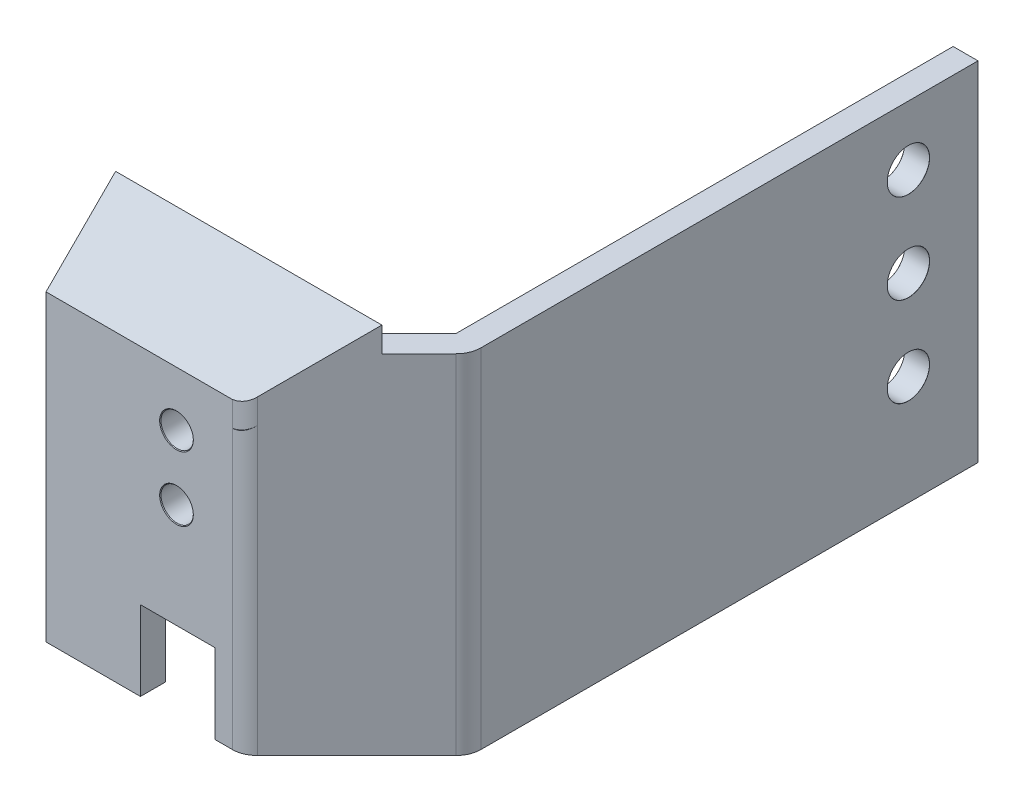
ISO-10303-21;
HEADER;
FILE_DESCRIPTION(('STEP AP214'),'2;1');
FILE_NAME('part.step','',(''),(''),'','','');
FILE_SCHEMA(('AUTOMOTIVE_DESIGN { 1 0 10303 214 1 1 1 1 }'));
ENDSEC;
DATA;
#1=APPLICATION_CONTEXT('core data for automotive mechanical design processes');
#2=APPLICATION_PROTOCOL_DEFINITION('international standard','automotive_design',2000,#1);
#3=PRODUCT_CONTEXT('',#1,'mechanical');
#4=PRODUCT('Part','Part','',(#3));
#5=PRODUCT_RELATED_PRODUCT_CATEGORY('part','',(#4));
#6=PRODUCT_DEFINITION_FORMATION('','',#4);
#7=PRODUCT_DEFINITION_CONTEXT('part definition',#1,'design');
#8=PRODUCT_DEFINITION('design','',#6,#7);
#9=PRODUCT_DEFINITION_SHAPE('','',#8);
#10=(LENGTH_UNIT() NAMED_UNIT(*) SI_UNIT(.MILLI.,.METRE.));
#11=(NAMED_UNIT(*) PLANE_ANGLE_UNIT() SI_UNIT($,.RADIAN.));
#12=(NAMED_UNIT(*) SI_UNIT($,.STERADIAN.) SOLID_ANGLE_UNIT());
#13=UNCERTAINTY_MEASURE_WITH_UNIT(LENGTH_MEASURE(1.E-05),#10,'distance_accuracy_value','');
#14=(GEOMETRIC_REPRESENTATION_CONTEXT(3) GLOBAL_UNCERTAINTY_ASSIGNED_CONTEXT((#13)) GLOBAL_UNIT_ASSIGNED_CONTEXT((#10,
#11,#12)) REPRESENTATION_CONTEXT('',''));
#15=CARTESIAN_POINT('',(0.,0.,0.));
#16=DIRECTION('',(0.,0.,1.));
#17=DIRECTION('',(1.,0.,0.));
#18=AXIS2_PLACEMENT_3D('',#15,#16,#17);
#19=CARTESIAN_POINT('',(-10.,0.,0.));
#20=DIRECTION('',(0.,-1.,0.));
#21=DIRECTION('',(0.,0.,-1.));
#22=AXIS2_PLACEMENT_3D('',#19,#20,#21);
#23=PLANE('',#22);
#24=DIRECTION('',(0.,0.,1.));
#25=VECTOR('',#24,1.);
#26=CARTESIAN_POINT('',(-87.,0.,-200.));
#27=LINE('',#26,#25);
#28=CARTESIAN_POINT('',(-87.,0.,39.9999999999999));
#29=VERTEX_POINT('',#28);
#30=CARTESIAN_POINT('',(-87.,0.,50.));
#31=VERTEX_POINT('',#30);
#32=EDGE_CURVE('E387',#29,#31,#27,.T.);
#33=ORIENTED_EDGE('',*,*,#32,.T.);
#34=DIRECTION('',(1.,0.,0.));
#35=VECTOR('',#34,1.);
#36=CARTESIAN_POINT('',(-125.,0.,49.9999999999999));
#37=LINE('',#36,#35);
#38=CARTESIAN_POINT('',(-125.,0.,49.9999999999999));
#39=VERTEX_POINT('',#38);
#40=EDGE_CURVE('E390',#39,#31,#37,.T.);
#41=ORIENTED_EDGE('',*,*,#40,.F.);
#42=DIRECTION('',(0.,0.,1.));
#43=VECTOR('',#42,1.);
#44=CARTESIAN_POINT('',(-125.,0.,39.9999999999999));
#45=LINE('',#44,#43);
#46=CARTESIAN_POINT('',(-125.,0.,39.9999999999999));
#47=VERTEX_POINT('',#46);
#48=EDGE_CURVE('E412',#47,#39,#45,.T.);
#49=ORIENTED_EDGE('',*,*,#48,.F.);
#50=DIRECTION('',(-1.,0.,0.));
#51=VECTOR('',#50,1.);
#52=CARTESIAN_POINT('',(-50.,0.,39.9999999999999));
#53=LINE('',#52,#51);
#54=EDGE_CURVE('E392',#29,#47,#53,.T.);
#55=ORIENTED_EDGE('',*,*,#54,.F.);
#56=EDGE_LOOP('',(#33,#41,#49,#55));
#57=FACE_BOUND('',#56,.T.);
#58=ADVANCED_FACE('F87',(#57),#23,.T.);
#59=CARTESIAN_POINT('',(-10.,140.,0.));
#60=DIRECTION('',(0.,1.,0.));
#61=DIRECTION('',(0.,0.,1.));
#62=AXIS2_PLACEMENT_3D('',#59,#60,#61);
#63=PLANE('',#62);
#64=DIRECTION('',(1.,0.,0.));
#65=VECTOR('',#64,1.);
#66=CARTESIAN_POINT('',(-125.,140.,21.9999999999997));
#67=LINE('',#66,#65);
#68=CARTESIAN_POINT('',(-31.9999999999997,140.,21.9999999999997));
#69=VERTEX_POINT('',#68);
#70=CARTESIAN_POINT('',(-17.8578643762687,140.,21.9999999999997));
#71=VERTEX_POINT('',#70);
#72=EDGE_CURVE('E228',#69,#71,#67,.T.);
#73=ORIENTED_EDGE('',*,*,#72,.T.);
#74=DIRECTION('',(0.707106781186549,0.,-0.707106781186546));
#75=VECTOR('',#74,1.);
#76=CARTESIAN_POINT('',(-42.9289321881345,140.,47.0710678118654));
#77=LINE('',#76,#75);
#78=CARTESIAN_POINT('',(-2.92893218813454,140.,7.07106781186554));
#79=VERTEX_POINT('',#78);
#80=EDGE_CURVE('E449',#71,#79,#77,.T.);
#81=ORIENTED_EDGE('',*,*,#80,.T.);
#82=CARTESIAN_POINT('',(-10.,140.,0.));
#83=DIRECTION('',(0.,1.,0.));
#84=DIRECTION('',(0.,0.,1.));
#85=AXIS2_PLACEMENT_3D('',#82,#83,#84);
#86=CIRCLE('',#85,10.);
#87=CARTESIAN_POINT('',(0.,140.,0.));
#88=VERTEX_POINT('',#87);
#89=EDGE_CURVE('E451',#79,#88,#86,.T.);
#90=ORIENTED_EDGE('',*,*,#89,.T.);
#91=DIRECTION('',(0.,0.,1.));
#92=VECTOR('',#91,1.);
#93=CARTESIAN_POINT('',(0.,140.,0.));
#94=LINE('',#93,#92);
#95=CARTESIAN_POINT('',(0.,140.,-200.));
#96=VERTEX_POINT('',#95);
#97=EDGE_CURVE('E132',#96,#88,#94,.T.);
#98=ORIENTED_EDGE('',*,*,#97,.F.);
#99=DIRECTION('',(1.,0.,0.));
#100=VECTOR('',#99,1.);
#101=CARTESIAN_POINT('',(-10.,140.,-200.));
#102=LINE('',#101,#100);
#103=CARTESIAN_POINT('',(-10.,140.,-200.));
#104=VERTEX_POINT('',#103);
#105=EDGE_CURVE('E12',#104,#96,#102,.T.);
#106=ORIENTED_EDGE('',*,*,#105,.F.);
#107=DIRECTION('',(0.,0.,1.));
#108=VECTOR('',#107,1.);
#109=CARTESIAN_POINT('',(-10.,140.,0.));
#110=LINE('',#109,#108);
#111=CARTESIAN_POINT('',(-10.,140.,0.));
#112=VERTEX_POINT('',#111);
#113=EDGE_CURVE('E433',#104,#112,#110,.T.);
#114=ORIENTED_EDGE('',*,*,#113,.T.);
#115=DIRECTION('',(-0.707106781186549,0.,0.707106781186546));
#116=VECTOR('',#115,1.);
#117=CARTESIAN_POINT('',(-10.,140.,0.));
#118=LINE('',#117,#116);
#119=EDGE_CURVE('E452',#112,#69,#118,.T.);
#120=ORIENTED_EDGE('',*,*,#119,.T.);
#121=EDGE_LOOP('',(#73,#81,#90,#98,#106,#114,#120));
#122=FACE_BOUND('',#121,.T.);
#123=ADVANCED_FACE('F370',(#122),#63,.T.);
#124=CARTESIAN_POINT('',(-10.,0.,-200.));
#125=DIRECTION('',(0.,0.,-1.));
#126=DIRECTION('',(0.,1.,0.));
#127=AXIS2_PLACEMENT_3D('',#124,#125,#126);
#128=PLANE('',#127);
#129=DIRECTION('',(0.,1.,0.));
#130=VECTOR('',#129,1.);
#131=CARTESIAN_POINT('',(0.,0.,-200.));
#132=LINE('',#131,#130);
#133=CARTESIAN_POINT('',(0.,0.,-200.));
#134=VERTEX_POINT('',#133);
#135=EDGE_CURVE('E440',#134,#96,#132,.T.);
#136=ORIENTED_EDGE('',*,*,#135,.F.);
#137=DIRECTION('',(1.,0.,0.));
#138=VECTOR('',#137,1.);
#139=CARTESIAN_POINT('',(-10.,0.,-200.));
#140=LINE('',#139,#138);
#141=CARTESIAN_POINT('',(-10.,0.,-200.));
#142=VERTEX_POINT('',#141);
#143=EDGE_CURVE('E96',#142,#134,#140,.T.);
#144=ORIENTED_EDGE('',*,*,#143,.F.);
#145=DIRECTION('',(0.,1.,0.));
#146=VECTOR('',#145,1.);
#147=CARTESIAN_POINT('',(-10.,0.,-200.));
#148=LINE('',#147,#146);
#149=EDGE_CURVE('E430',#142,#104,#148,.T.);
#150=ORIENTED_EDGE('',*,*,#149,.T.);
#151=ORIENTED_EDGE('',*,*,#105,.T.);
#152=EDGE_LOOP('',(#136,#144,#150,#151));
#153=FACE_BOUND('',#152,.T.);
#154=ADVANCED_FACE('F372',(#153),#128,.T.);
#155=DIRECTION('',(0.,0.,1.));
#156=VECTOR('',#155,1.);
#157=CARTESIAN_POINT('',(-57.,0.,-200.));
#158=LINE('',#157,#156);
#159=CARTESIAN_POINT('',(-57.,0.,39.9999999999999));
#160=VERTEX_POINT('',#159);
#161=CARTESIAN_POINT('',(-57.,0.,49.9999999999999));
#162=VERTEX_POINT('',#161);
#163=EDGE_CURVE('E104',#160,#162,#158,.T.);
#164=ORIENTED_EDGE('',*,*,#163,.F.);
#165=CARTESIAN_POINT('',(-50.,0.,39.9999999999999));
#166=VERTEX_POINT('',#165);
#167=EDGE_CURVE('E415',#166,#160,#53,.T.);
#168=ORIENTED_EDGE('',*,*,#167,.F.);
#169=DIRECTION('',(-0.707106781186549,0.,0.707106781186546));
#170=VECTOR('',#169,1.);
#171=CARTESIAN_POINT('',(-10.,0.,0.));
#172=LINE('',#171,#170);
#173=CARTESIAN_POINT('',(-10.,0.,0.));
#174=VERTEX_POINT('',#173);
#175=EDGE_CURVE('E427',#174,#166,#172,.T.);
#176=ORIENTED_EDGE('',*,*,#175,.F.);
#177=DIRECTION('',(0.,0.,-1.));
#178=VECTOR('',#177,1.);
#179=CARTESIAN_POINT('',(-10.,0.,0.));
#180=LINE('',#179,#178);
#181=EDGE_CURVE('E137',#174,#142,#180,.T.);
#182=ORIENTED_EDGE('',*,*,#181,.T.);
#183=ORIENTED_EDGE('',*,*,#143,.T.);
#184=DIRECTION('',(0.,0.,-1.));
#185=VECTOR('',#184,1.);
#186=CARTESIAN_POINT('',(0.,0.,0.));
#187=LINE('',#186,#185);
#188=CARTESIAN_POINT('',(0.,0.,0.));
#189=VERTEX_POINT('',#188);
#190=EDGE_CURVE('E437',#189,#134,#187,.T.);
#191=ORIENTED_EDGE('',*,*,#190,.F.);
#192=CARTESIAN_POINT('',(-10.,0.,0.));
#193=DIRECTION('',(0.,-1.,0.));
#194=DIRECTION('',(0.,0.,-1.));
#195=AXIS2_PLACEMENT_3D('',#192,#193,#194);
#196=CIRCLE('',#195,10.);
#197=CARTESIAN_POINT('',(-2.92893218813454,0.,7.07106781186554));
#198=VERTEX_POINT('',#197);
#199=EDGE_CURVE('E421',#198,#189,#196,.F.);
#200=ORIENTED_EDGE('',*,*,#199,.F.);
#201=DIRECTION('',(0.707106781186549,0.,-0.707106781186546));
#202=VECTOR('',#201,1.);
#203=CARTESIAN_POINT('',(-42.9289321881345,0.,47.0710678118654));
#204=LINE('',#203,#202);
#205=CARTESIAN_POINT('',(-42.9289321881345,0.,47.0710678118654));
#206=VERTEX_POINT('',#205);
#207=EDGE_CURVE('E422',#206,#198,#204,.T.);
#208=ORIENTED_EDGE('',*,*,#207,.F.);
#209=CARTESIAN_POINT('',(-50.,0.,39.9999999999999));
#210=DIRECTION('',(0.,-1.,0.));
#211=DIRECTION('',(0.,0.,-1.));
#212=AXIS2_PLACEMENT_3D('',#209,#210,#211);
#213=CIRCLE('',#212,10.);
#214=CARTESIAN_POINT('',(-50.,0.,49.9999999999999));
#215=VERTEX_POINT('',#214);
#216=EDGE_CURVE('E407',#215,#206,#213,.F.);
#217=ORIENTED_EDGE('',*,*,#216,.F.);
#218=EDGE_CURVE('E404',#162,#215,#37,.T.);
#219=ORIENTED_EDGE('',*,*,#218,.F.);
#220=EDGE_LOOP('',(#164,#168,#176,#182,#183,#191,#200,#208,#217,#219));
#221=FACE_BOUND('',#220,.T.);
#222=ADVANCED_FACE('F89',(#221),#23,.T.);
#223=CARTESIAN_POINT('',(-10.,0.,0.));
#224=DIRECTION('',(-1.,0.,0.));
#225=DIRECTION('',(0.,0.,1.));
#226=AXIS2_PLACEMENT_3D('',#223,#224,#225);
#227=PLANE('',#226);
#228=CARTESIAN_POINT('',(-10.,116.,-172.));
#229=DIRECTION('',(1.,0.,0.));
#230=DIRECTION('',(0.,0.,-1.));
#231=AXIS2_PLACEMENT_3D('',#228,#229,#230);
#232=CIRCLE('',#231,8.52500000000001);
#233=CARTESIAN_POINT('',(-10.,116.,-180.525));
#234=VERTEX_POINT('',#233);
#235=EDGE_CURVE('E598',#234,#234,#232,.T.);
#236=ORIENTED_EDGE('',*,*,#235,.T.);
#237=EDGE_LOOP('',(#236));
#238=FACE_BOUND('',#237,.T.);
#239=CARTESIAN_POINT('',(-10.,80.,-172.));
#240=DIRECTION('',(1.,0.,0.));
#241=DIRECTION('',(0.,0.,-1.));
#242=AXIS2_PLACEMENT_3D('',#239,#240,#241);
#243=CIRCLE('',#242,8.52500000000001);
#244=CARTESIAN_POINT('',(-10.,80.,-180.525));
#245=VERTEX_POINT('',#244);
#246=EDGE_CURVE('E586',#245,#245,#243,.T.);
#247=ORIENTED_EDGE('',*,*,#246,.T.);
#248=EDGE_LOOP('',(#247));
#249=FACE_BOUND('',#248,.T.);
#250=CARTESIAN_POINT('',(-10.,44.,-172.));
#251=DIRECTION('',(1.,0.,0.));
#252=DIRECTION('',(0.,0.,-1.));
#253=AXIS2_PLACEMENT_3D('',#250,#251,#252);
#254=CIRCLE('',#253,8.525);
#255=CARTESIAN_POINT('',(-10.,44.,-180.525));
#256=VERTEX_POINT('',#255);
#257=EDGE_CURVE('E572',#256,#256,#254,.T.);
#258=ORIENTED_EDGE('',*,*,#257,.T.);
#259=EDGE_LOOP('',(#258));
#260=FACE_BOUND('',#259,.T.);
#261=DIRECTION('',(0.,-1.,0.));
#262=VECTOR('',#261,1.);
#263=CARTESIAN_POINT('',(-10.,0.,0.));
#264=LINE('',#263,#262);
#265=EDGE_CURVE('E113',#112,#174,#264,.T.);
#266=ORIENTED_EDGE('',*,*,#265,.F.);
#267=ORIENTED_EDGE('',*,*,#113,.F.);
#268=ORIENTED_EDGE('',*,*,#149,.F.);
#269=ORIENTED_EDGE('',*,*,#181,.F.);
#270=EDGE_LOOP('',(#266,#267,#268,#269));
#271=FACE_BOUND('',#270,.T.);
#272=ADVANCED_FACE('F363',(#238,#249,#260,#271),#227,.T.);
#273=CARTESIAN_POINT('',(0.,0.,0.));
#274=DIRECTION('',(-1.,0.,0.));
#275=DIRECTION('',(0.,0.,1.));
#276=AXIS2_PLACEMENT_3D('',#273,#274,#275);
#277=PLANE('',#276);
#278=CARTESIAN_POINT('',(0.,116.,-172.));
#279=DIRECTION('',(1.,0.,0.));
#280=DIRECTION('',(0.,0.,-1.));
#281=AXIS2_PLACEMENT_3D('',#278,#279,#280);
#282=CIRCLE('',#281,8.52500000000001);
#283=CARTESIAN_POINT('',(0.,116.,-180.525));
#284=VERTEX_POINT('',#283);
#285=EDGE_CURVE('E595',#284,#284,#282,.T.);
#286=ORIENTED_EDGE('',*,*,#285,.F.);
#287=EDGE_LOOP('',(#286));
#288=FACE_BOUND('',#287,.T.);
#289=CARTESIAN_POINT('',(0.,80.,-172.));
#290=DIRECTION('',(1.,0.,0.));
#291=DIRECTION('',(0.,0.,-1.));
#292=AXIS2_PLACEMENT_3D('',#289,#290,#291);
#293=CIRCLE('',#292,8.52500000000001);
#294=CARTESIAN_POINT('',(0.,80.,-180.525));
#295=VERTEX_POINT('',#294);
#296=EDGE_CURVE('E583',#295,#295,#293,.T.);
#297=ORIENTED_EDGE('',*,*,#296,.F.);
#298=EDGE_LOOP('',(#297));
#299=FACE_BOUND('',#298,.T.);
#300=CARTESIAN_POINT('',(0.,44.,-172.));
#301=DIRECTION('',(1.,0.,0.));
#302=DIRECTION('',(0.,0.,-1.));
#303=AXIS2_PLACEMENT_3D('',#300,#301,#302);
#304=CIRCLE('',#303,8.52500000000001);
#305=CARTESIAN_POINT('',(0.,44.,-180.525));
#306=VERTEX_POINT('',#305);
#307=EDGE_CURVE('E568',#306,#306,#304,.T.);
#308=ORIENTED_EDGE('',*,*,#307,.F.);
#309=EDGE_LOOP('',(#308));
#310=FACE_BOUND('',#309,.T.);
#311=DIRECTION('',(0.,-1.,0.));
#312=VECTOR('',#311,1.);
#313=CARTESIAN_POINT('',(0.,0.,0.));
#314=LINE('',#313,#312);
#315=EDGE_CURVE('E435',#88,#189,#314,.T.);
#316=ORIENTED_EDGE('',*,*,#315,.T.);
#317=ORIENTED_EDGE('',*,*,#190,.T.);
#318=ORIENTED_EDGE('',*,*,#135,.T.);
#319=ORIENTED_EDGE('',*,*,#97,.T.);
#320=EDGE_LOOP('',(#316,#317,#318,#319));
#321=FACE_BOUND('',#320,.T.);
#322=ADVANCED_FACE('F361',(#288,#299,#310,#321),#277,.F.);
#323=CARTESIAN_POINT('',(-10.,-134.629120178363,0.));
#324=DIRECTION('',(-0.707106781186546,0.,-0.707106781186549));
#325=DIRECTION('',(-0.707106781186549,0.,0.707106781186546));
#326=AXIS2_PLACEMENT_3D('',#323,#324,#325);
#327=PLANE('',#326);
#328=DIRECTION('',(-0.577350269189629,-0.577350269189621,0.577350269189627));
#329=VECTOR('',#328,1.);
#330=CARTESIAN_POINT('',(-108.876373392787,63.1236266072137,98.8763733927868));
#331=LINE('',#330,#329);
#332=CARTESIAN_POINT('',(-50.,122.,39.9999999999999));
#333=VERTEX_POINT('',#332);
#334=EDGE_CURVE('E505',#69,#333,#331,.T.);
#335=ORIENTED_EDGE('',*,*,#334,.F.);
#336=ORIENTED_EDGE('',*,*,#119,.F.);
#337=ORIENTED_EDGE('',*,*,#265,.T.);
#338=ORIENTED_EDGE('',*,*,#175,.T.);
#339=DIRECTION('',(0.,1.,0.));
#340=VECTOR('',#339,1.);
#341=CARTESIAN_POINT('',(-50.,-134.629120178363,39.9999999999999));
#342=LINE('',#341,#340);
#343=EDGE_CURVE('E424',#166,#333,#342,.T.);
#344=ORIENTED_EDGE('',*,*,#343,.T.);
#345=EDGE_LOOP('',(#335,#336,#337,#338,#344));
#346=FACE_BOUND('',#345,.T.);
#347=ADVANCED_FACE('F357',(#346),#327,.T.);
#348=CARTESIAN_POINT('',(-50.,-134.629120178363,39.9999999999999));
#349=DIRECTION('',(0.,0.,-1.));
#350=DIRECTION('',(-1.,0.,0.));
#351=AXIS2_PLACEMENT_3D('',#348,#349,#350);
#352=PLANE('',#351);
#353=CARTESIAN_POINT('',(-72.5,100.,40.));
#354=DIRECTION('',(0.,0.,1.));
#355=DIRECTION('',(1.,0.,0.));
#356=AXIS2_PLACEMENT_3D('',#353,#354,#355);
#357=CIRCLE('',#356,6.525);
#358=CARTESIAN_POINT('',(-65.975,100.,40.));
#359=VERTEX_POINT('',#358);
#360=EDGE_CURVE('E231',#359,#359,#357,.T.);
#361=ORIENTED_EDGE('',*,*,#360,.T.);
#362=EDGE_LOOP('',(#361));
#363=FACE_BOUND('',#362,.T.);
#364=CARTESIAN_POINT('',(-72.5,74.,40.));
#365=DIRECTION('',(0.,0.,1.));
#366=DIRECTION('',(1.,0.,0.));
#367=AXIS2_PLACEMENT_3D('',#364,#365,#366);
#368=CIRCLE('',#367,6.525);
#369=CARTESIAN_POINT('',(-65.975,74.,40.));
#370=VERTEX_POINT('',#369);
#371=EDGE_CURVE('E537',#370,#370,#368,.T.);
#372=ORIENTED_EDGE('',*,*,#371,.T.);
#373=EDGE_LOOP('',(#372));
#374=FACE_BOUND('',#373,.T.);
#375=DIRECTION('',(0.,1.,0.));
#376=VECTOR('',#375,1.);
#377=CARTESIAN_POINT('',(-87.,-134.629120178363,39.9999999999999));
#378=LINE('',#377,#376);
#379=CARTESIAN_POINT('',(-87.,32.0000000000001,39.9999999999999));
#380=VERTEX_POINT('',#379);
#381=EDGE_CURVE('E446',#29,#380,#378,.T.);
#382=ORIENTED_EDGE('',*,*,#381,.F.);
#383=ORIENTED_EDGE('',*,*,#54,.T.);
#384=DIRECTION('',(0.,1.,0.));
#385=VECTOR('',#384,1.);
#386=CARTESIAN_POINT('',(-125.,-134.629120178363,39.9999999999999));
#387=LINE('',#386,#385);
#388=CARTESIAN_POINT('',(-125.,122.,40.));
#389=VERTEX_POINT('',#388);
#390=EDGE_CURVE('E414',#47,#389,#387,.T.);
#391=ORIENTED_EDGE('',*,*,#390,.T.);
#392=DIRECTION('',(-1.,0.,0.));
#393=VECTOR('',#392,1.);
#394=CARTESIAN_POINT('',(-50.,122.,39.9999999999999));
#395=LINE('',#394,#393);
#396=EDGE_CURVE('E238',#333,#389,#395,.T.);
#397=ORIENTED_EDGE('',*,*,#396,.F.);
#398=ORIENTED_EDGE('',*,*,#343,.F.);
#399=ORIENTED_EDGE('',*,*,#167,.T.);
#400=DIRECTION('',(0.,-1.,0.));
#401=VECTOR('',#400,1.);
#402=CARTESIAN_POINT('',(-57.,-134.629120178363,39.9999999999999));
#403=LINE('',#402,#401);
#404=CARTESIAN_POINT('',(-57.,32.0000000000001,39.9999999999999));
#405=VERTEX_POINT('',#404);
#406=EDGE_CURVE('E496',#405,#160,#403,.T.);
#407=ORIENTED_EDGE('',*,*,#406,.F.);
#408=DIRECTION('',(1.,0.,0.));
#409=VECTOR('',#408,1.);
#410=CARTESIAN_POINT('',(-50.,32.0000000000001,39.9999999999999));
#411=LINE('',#410,#409);
#412=EDGE_CURVE('E501',#380,#405,#411,.T.);
#413=ORIENTED_EDGE('',*,*,#412,.F.);
#414=EDGE_LOOP('',(#382,#383,#391,#397,#398,#399,#407,#413));
#415=FACE_BOUND('',#414,.T.);
#416=ADVANCED_FACE('F354',(#363,#374,#415),#352,.T.);
#417=CARTESIAN_POINT('',(-125.,-134.629120178363,39.9999999999999));
#418=DIRECTION('',(-1.,0.,0.));
#419=DIRECTION('',(0.,0.,1.));
#420=AXIS2_PLACEMENT_3D('',#417,#418,#419);
#421=PLANE('',#420);
#422=DIRECTION('',(0.,1.,0.));
#423=VECTOR('',#422,1.);
#424=CARTESIAN_POINT('',(-125.,-134.629120178363,49.9999999999999));
#425=LINE('',#424,#423);
#426=CARTESIAN_POINT('',(-125.,122.,49.9999999999999));
#427=VERTEX_POINT('',#426);
#428=EDGE_CURVE('E401',#39,#427,#425,.T.);
#429=ORIENTED_EDGE('',*,*,#428,.T.);
#430=DIRECTION('',(0.,-0.707106781186545,0.70710678118655));
#431=VECTOR('',#430,1.);
#432=CARTESIAN_POINT('',(-125.,150.,21.9999999999998));
#433=LINE('',#432,#431);
#434=CARTESIAN_POINT('',(-125.,150.,21.9999999999998));
#435=VERTEX_POINT('',#434);
#436=EDGE_CURVE('E245',#435,#427,#433,.T.);
#437=ORIENTED_EDGE('',*,*,#436,.F.);
#438=DIRECTION('',(0.,1.,0.));
#439=VECTOR('',#438,1.);
#440=CARTESIAN_POINT('',(-125.,140.,21.9999999999998));
#441=LINE('',#440,#439);
#442=CARTESIAN_POINT('',(-125.,140.,21.9999999999998));
#443=VERTEX_POINT('',#442);
#444=EDGE_CURVE('E225',#443,#435,#441,.T.);
#445=ORIENTED_EDGE('',*,*,#444,.F.);
#446=DIRECTION('',(0.,-0.707106781186545,0.70710678118655));
#447=VECTOR('',#446,1.);
#448=CARTESIAN_POINT('',(-125.,140.,21.9999999999998));
#449=LINE('',#448,#447);
#450=EDGE_CURVE('E235',#443,#389,#449,.T.);
#451=ORIENTED_EDGE('',*,*,#450,.T.);
#452=ORIENTED_EDGE('',*,*,#390,.F.);
#453=ORIENTED_EDGE('',*,*,#48,.T.);
#454=EDGE_LOOP('',(#429,#437,#445,#451,#452,#453));
#455=FACE_BOUND('',#454,.T.);
#456=ADVANCED_FACE('F243',(#455),#421,.T.);
#457=CARTESIAN_POINT('',(-125.,-134.629120178363,49.9999999999999));
#458=DIRECTION('',(0.,0.,1.));
#459=DIRECTION('',(1.,0.,0.));
#460=AXIS2_PLACEMENT_3D('',#457,#458,#459);
#461=PLANE('',#460);
#462=CARTESIAN_POINT('',(-72.5,100.,50.));
#463=DIRECTION('',(0.,0.,1.));
#464=DIRECTION('',(1.,0.,0.));
#465=AXIS2_PLACEMENT_3D('',#462,#463,#464);
#466=CIRCLE('',#465,6.775);
#467=CARTESIAN_POINT('',(-65.725,100.,50.));
#468=VERTEX_POINT('',#467);
#469=EDGE_CURVE('E528',#468,#468,#466,.T.);
#470=ORIENTED_EDGE('',*,*,#469,.F.);
#471=EDGE_LOOP('',(#470));
#472=FACE_BOUND('',#471,.T.);
#473=CARTESIAN_POINT('',(-72.5,74.,50.));
#474=DIRECTION('',(0.,0.,1.));
#475=DIRECTION('',(1.,0.,0.));
#476=AXIS2_PLACEMENT_3D('',#473,#474,#475);
#477=CIRCLE('',#476,6.775);
#478=CARTESIAN_POINT('',(-65.725,74.,50.));
#479=VERTEX_POINT('',#478);
#480=EDGE_CURVE('E540',#479,#479,#477,.T.);
#481=ORIENTED_EDGE('',*,*,#480,.F.);
#482=EDGE_LOOP('',(#481));
#483=FACE_BOUND('',#482,.T.);
#484=DIRECTION('',(0.,-1.,0.));
#485=VECTOR('',#484,1.);
#486=CARTESIAN_POINT('',(-87.,32.0000000000001,50.));
#487=LINE('',#486,#485);
#488=CARTESIAN_POINT('',(-87.,32.0000000000001,50.));
#489=VERTEX_POINT('',#488);
#490=EDGE_CURVE('E399',#489,#31,#487,.T.);
#491=ORIENTED_EDGE('',*,*,#490,.F.);
#492=DIRECTION('',(-1.,0.,0.));
#493=VECTOR('',#492,1.);
#494=CARTESIAN_POINT('',(-87.,32.0000000000001,50.));
#495=LINE('',#494,#493);
#496=CARTESIAN_POINT('',(-57.,32.0000000000001,50.));
#497=VERTEX_POINT('',#496);
#498=EDGE_CURVE('E394',#497,#489,#495,.T.);
#499=ORIENTED_EDGE('',*,*,#498,.F.);
#500=DIRECTION('',(0.,1.,0.));
#501=VECTOR('',#500,1.);
#502=CARTESIAN_POINT('',(-57.,32.0000000000001,50.));
#503=LINE('',#502,#501);
#504=EDGE_CURVE('E485',#162,#497,#503,.T.);
#505=ORIENTED_EDGE('',*,*,#504,.F.);
#506=ORIENTED_EDGE('',*,*,#218,.T.);
#507=DIRECTION('',(0.,1.,0.));
#508=VECTOR('',#507,1.);
#509=CARTESIAN_POINT('',(-50.,-134.629120178363,49.9999999999999));
#510=LINE('',#509,#508);
#511=CARTESIAN_POINT('',(-50.,112.,50.));
#512=VERTEX_POINT('',#511);
#513=EDGE_CURVE('E403',#215,#512,#510,.T.);
#514=ORIENTED_EDGE('',*,*,#513,.T.);
#515=DIRECTION('',(0.,1.,0.));
#516=VECTOR('',#515,1.);
#517=CARTESIAN_POINT('',(-50.,112.,50.));
#518=LINE('',#517,#516);
#519=CARTESIAN_POINT('',(-50.,122.,50.));
#520=VERTEX_POINT('',#519);
#521=EDGE_CURVE('E263',#512,#520,#518,.T.);
#522=ORIENTED_EDGE('',*,*,#521,.T.);
#523=DIRECTION('',(1.,0.,0.));
#524=VECTOR('',#523,1.);
#525=CARTESIAN_POINT('',(-125.,122.,49.9999999999999));
#526=LINE('',#525,#524);
#527=EDGE_CURVE('E247',#427,#520,#526,.T.);
#528=ORIENTED_EDGE('',*,*,#527,.F.);
#529=ORIENTED_EDGE('',*,*,#428,.F.);
#530=ORIENTED_EDGE('',*,*,#40,.T.);
#531=EDGE_LOOP('',(#491,#499,#505,#506,#514,#522,#528,#529,#530));
#532=FACE_BOUND('',#531,.T.);
#533=ADVANCED_FACE('F347',(#472,#483,#532),#461,.T.);
#534=CARTESIAN_POINT('',(-50.,-134.629120178363,39.9999999999999));
#535=DIRECTION('',(0.,1.,0.));
#536=DIRECTION('',(0.,0.,1.));
#537=AXIS2_PLACEMENT_3D('',#534,#535,#536);
#538=CYLINDRICAL_SURFACE('',#537,10.);
#539=CARTESIAN_POINT('',(-50.,122.,39.9999999999999));
#540=DIRECTION('',(0.,-0.707106781186551,-0.707106781186544));
#541=DIRECTION('',(0.,0.707106781186544,-0.707106781186551));
#542=AXIS2_PLACEMENT_3D('',#539,#540,#541);
#543=ELLIPSE('',#542,14.1421356237309,10.);
#544=CARTESIAN_POINT('',(-42.9289321881345,114.928932188135,47.0710678118654));
#545=VERTEX_POINT('',#544);
#546=EDGE_CURVE('E445',#512,#545,#543,.F.);
#547=ORIENTED_EDGE('',*,*,#546,.F.);
#548=ORIENTED_EDGE('',*,*,#513,.F.);
#549=ORIENTED_EDGE('',*,*,#216,.T.);
#550=DIRECTION('',(0.,1.,0.));
#551=VECTOR('',#550,1.);
#552=CARTESIAN_POINT('',(-42.9289321881345,-134.629120178363,47.0710678118654));
#553=LINE('',#552,#551);
#554=EDGE_CURVE('E463',#206,#545,#553,.T.);
#555=ORIENTED_EDGE('',*,*,#554,.T.);
#556=EDGE_LOOP('',(#547,#548,#549,#555));
#557=FACE_BOUND('',#556,.T.);
#558=ADVANCED_FACE('F343',(#557),#538,.T.);
#559=CARTESIAN_POINT('',(-42.9289321881345,-134.629120178363,47.0710678118654));
#560=DIRECTION('',(0.707106781186546,0.,0.707106781186549));
#561=DIRECTION('',(0.707106781186549,0.,-0.707106781186546));
#562=AXIS2_PLACEMENT_3D('',#559,#560,#561);
#563=PLANE('',#562);
#564=ORIENTED_EDGE('',*,*,#80,.F.);
#565=DIRECTION('',(0.,1.,0.));
#566=VECTOR('',#565,1.);
#567=CARTESIAN_POINT('',(-17.8578643762687,140.,21.9999999999997));
#568=LINE('',#567,#566);
#569=CARTESIAN_POINT('',(-17.8578643762687,150.,21.9999999999997));
#570=VERTEX_POINT('',#569);
#571=EDGE_CURVE('E278',#71,#570,#568,.T.);
#572=ORIENTED_EDGE('',*,*,#571,.T.);
#573=DIRECTION('',(0.577350269189629,0.577350269189622,-0.577350269189627));
#574=VECTOR('',#573,1.);
#575=CARTESIAN_POINT('',(-17.8578643762687,150.,21.9999999999997));
#576=LINE('',#575,#574);
#577=CARTESIAN_POINT('',(-42.9289321881345,124.928932188135,47.0710678118654));
#578=VERTEX_POINT('',#577);
#579=EDGE_CURVE('E481',#578,#570,#576,.T.);
#580=ORIENTED_EDGE('',*,*,#579,.F.);
#581=DIRECTION('',(0.,1.,0.));
#582=VECTOR('',#581,1.);
#583=CARTESIAN_POINT('',(-42.9289321881345,114.928932188135,47.0710678118654));
#584=LINE('',#583,#582);
#585=EDGE_CURVE('E478',#545,#578,#584,.T.);
#586=ORIENTED_EDGE('',*,*,#585,.F.);
#587=ORIENTED_EDGE('',*,*,#554,.F.);
#588=ORIENTED_EDGE('',*,*,#207,.T.);
#589=DIRECTION('',(0.,1.,0.));
#590=VECTOR('',#589,1.);
#591=CARTESIAN_POINT('',(-2.92893218813454,-134.629120178363,7.07106781186554));
#592=LINE('',#591,#590);
#593=EDGE_CURVE('E418',#198,#79,#592,.T.);
#594=ORIENTED_EDGE('',*,*,#593,.T.);
#595=EDGE_LOOP('',(#564,#572,#580,#586,#587,#588,#594));
#596=FACE_BOUND('',#595,.T.);
#597=ADVANCED_FACE('F339',(#596),#563,.T.);
#598=CARTESIAN_POINT('',(-10.,-134.629120178363,0.));
#599=DIRECTION('',(0.,1.,0.));
#600=DIRECTION('',(0.,0.,1.));
#601=AXIS2_PLACEMENT_3D('',#598,#599,#600);
#602=CYLINDRICAL_SURFACE('',#601,10.);
#603=ORIENTED_EDGE('',*,*,#593,.F.);
#604=ORIENTED_EDGE('',*,*,#199,.T.);
#605=ORIENTED_EDGE('',*,*,#315,.F.);
#606=ORIENTED_EDGE('',*,*,#89,.F.);
#607=EDGE_LOOP('',(#603,#604,#605,#606));
#608=FACE_BOUND('',#607,.T.);
#609=ADVANCED_FACE('F335',(#608),#602,.T.);
#610=CARTESIAN_POINT('',(-125.,122.,39.9999999999999));
#611=DIRECTION('',(0.,-0.707106781186551,-0.707106781186544));
#612=DIRECTION('',(0.,0.707106781186544,-0.707106781186551));
#613=AXIS2_PLACEMENT_3D('',#610,#611,#612);
#614=PLANE('',#613);
#615=ORIENTED_EDGE('',*,*,#546,.T.);
#616=CARTESIAN_POINT('',(-51.0355339059327,118.982233047034,43.0177669529664));
#617=DIRECTION('',(0.,0.707106781186541,0.707106781186554));
#618=DIRECTION('',(0.,-0.707106781186554,0.707106781186541));
#619=AXIS2_PLACEMENT_3D('',#616,#617,#618);
#620=CIRCLE('',#619,9.92851887828756);
#621=EDGE_CURVE('E260',#512,#545,#620,.T.);
#622=ORIENTED_EDGE('',*,*,#621,.F.);
#623=EDGE_LOOP('',(#615,#622));
#624=FACE_BOUND('',#623,.T.);
#625=ADVANCED_FACE('F331',(#624),#614,.F.);
#626=CARTESIAN_POINT('',(-87.,32.0000000000001,-200.));
#627=DIRECTION('',(-1.,0.,0.));
#628=DIRECTION('',(0.,0.,1.));
#629=AXIS2_PLACEMENT_3D('',#626,#627,#628);
#630=PLANE('',#629);
#631=ORIENTED_EDGE('',*,*,#381,.T.);
#632=DIRECTION('',(0.,0.,1.));
#633=VECTOR('',#632,1.);
#634=CARTESIAN_POINT('',(-87.,32.0000000000001,-200.));
#635=LINE('',#634,#633);
#636=EDGE_CURVE('E494',#380,#489,#635,.T.);
#637=ORIENTED_EDGE('',*,*,#636,.T.);
#638=ORIENTED_EDGE('',*,*,#490,.T.);
#639=ORIENTED_EDGE('',*,*,#32,.F.);
#640=EDGE_LOOP('',(#631,#637,#638,#639));
#641=FACE_BOUND('',#640,.T.);
#642=ADVANCED_FACE('F325',(#641),#630,.F.);
#643=CARTESIAN_POINT('',(-87.,32.0000000000001,-200.));
#644=DIRECTION('',(0.,1.,0.));
#645=DIRECTION('',(0.,0.,1.));
#646=AXIS2_PLACEMENT_3D('',#643,#644,#645);
#647=PLANE('',#646);
#648=ORIENTED_EDGE('',*,*,#412,.T.);
#649=DIRECTION('',(0.,0.,1.));
#650=VECTOR('',#649,1.);
#651=CARTESIAN_POINT('',(-57.,32.0000000000001,-200.));
#652=LINE('',#651,#650);
#653=EDGE_CURVE('E497',#405,#497,#652,.T.);
#654=ORIENTED_EDGE('',*,*,#653,.T.);
#655=ORIENTED_EDGE('',*,*,#498,.T.);
#656=ORIENTED_EDGE('',*,*,#636,.F.);
#657=EDGE_LOOP('',(#648,#654,#655,#656));
#658=FACE_BOUND('',#657,.T.);
#659=ADVANCED_FACE('F322',(#658),#647,.F.);
#660=CARTESIAN_POINT('',(-57.,32.0000000000001,-200.));
#661=DIRECTION('',(1.,0.,0.));
#662=DIRECTION('',(0.,0.,-1.));
#663=AXIS2_PLACEMENT_3D('',#660,#661,#662);
#664=PLANE('',#663);
#665=ORIENTED_EDGE('',*,*,#406,.T.);
#666=ORIENTED_EDGE('',*,*,#163,.T.);
#667=ORIENTED_EDGE('',*,*,#504,.T.);
#668=ORIENTED_EDGE('',*,*,#653,.F.);
#669=EDGE_LOOP('',(#665,#666,#667,#668));
#670=FACE_BOUND('',#669,.T.);
#671=ADVANCED_FACE('F320',(#670),#664,.F.);
#672=CARTESIAN_POINT('',(-72.5,74.,40.025));
#673=DIRECTION('',(0.,0.,-1.));
#674=DIRECTION('',(-1.,0.,0.));
#675=AXIS2_PLACEMENT_3D('',#672,#673,#674);
#676=CONICAL_SURFACE('',#675,6.49999999999999,0.785398163397587);
#677=ORIENTED_EDGE('',*,*,#371,.F.);
#678=EDGE_LOOP('',(#677));
#679=FACE_BOUND('',#678,.T.);
#680=CARTESIAN_POINT('',(-72.5,74.,40.025));
#681=DIRECTION('',(0.,0.,1.));
#682=DIRECTION('',(1.,0.,0.));
#683=AXIS2_PLACEMENT_3D('',#680,#681,#682);
#684=CIRCLE('',#683,6.49999999999999);
#685=CARTESIAN_POINT('',(-66.,74.,40.025));
#686=VERTEX_POINT('',#685);
#687=EDGE_CURVE('E490',#686,#686,#684,.T.);
#688=ORIENTED_EDGE('',*,*,#687,.T.);
#689=EDGE_LOOP('',(#688));
#690=FACE_BOUND('',#689,.T.);
#691=ADVANCED_FACE('F316',(#679,#690),#676,.F.);
#692=CARTESIAN_POINT('',(-72.5,74.,50.));
#693=DIRECTION('',(0.,0.,1.));
#694=DIRECTION('',(1.,0.,0.));
#695=AXIS2_PLACEMENT_3D('',#692,#693,#694);
#696=CYLINDRICAL_SURFACE('',#695,6.49999999999999);
#697=ORIENTED_EDGE('',*,*,#687,.F.);
#698=EDGE_LOOP('',(#697));
#699=FACE_BOUND('',#698,.T.);
#700=CARTESIAN_POINT('',(-72.5,74.,49.725));
#701=DIRECTION('',(0.,0.,1.));
#702=DIRECTION('',(1.,0.,0.));
#703=AXIS2_PLACEMENT_3D('',#700,#701,#702);
#704=CIRCLE('',#703,6.49999999999999);
#705=CARTESIAN_POINT('',(-66.,74.,49.725));
#706=VERTEX_POINT('',#705);
#707=EDGE_CURVE('E543',#706,#706,#704,.T.);
#708=ORIENTED_EDGE('',*,*,#707,.T.);
#709=EDGE_LOOP('',(#708));
#710=FACE_BOUND('',#709,.T.);
#711=ADVANCED_FACE('F312',(#699,#710),#696,.F.);
#712=CARTESIAN_POINT('',(-72.5,74.,50.));
#713=DIRECTION('',(0.,0.,1.));
#714=DIRECTION('',(1.,0.,0.));
#715=AXIS2_PLACEMENT_3D('',#712,#713,#714);
#716=CONICAL_SURFACE('',#715,6.775,0.785398163397461);
#717=ORIENTED_EDGE('',*,*,#707,.F.);
#718=EDGE_LOOP('',(#717));
#719=FACE_BOUND('',#718,.T.);
#720=ORIENTED_EDGE('',*,*,#480,.T.);
#721=EDGE_LOOP('',(#720));
#722=FACE_BOUND('',#721,.T.);
#723=ADVANCED_FACE('F308',(#719,#722),#716,.F.);
#724=CARTESIAN_POINT('',(-72.5,100.,40.025));
#725=DIRECTION('',(0.,0.,-1.));
#726=DIRECTION('',(-1.,0.,0.));
#727=AXIS2_PLACEMENT_3D('',#724,#725,#726);
#728=CONICAL_SURFACE('',#727,6.49999999999999,0.785398163397587);
#729=ORIENTED_EDGE('',*,*,#360,.F.);
#730=EDGE_LOOP('',(#729));
#731=FACE_BOUND('',#730,.T.);
#732=CARTESIAN_POINT('',(-72.5,100.,40.025));
#733=DIRECTION('',(0.,0.,1.));
#734=DIRECTION('',(1.,0.,0.));
#735=AXIS2_PLACEMENT_3D('',#732,#733,#734);
#736=CIRCLE('',#735,6.49999999999999);
#737=CARTESIAN_POINT('',(-66.,100.,40.025));
#738=VERTEX_POINT('',#737);
#739=EDGE_CURVE('E534',#738,#738,#736,.T.);
#740=ORIENTED_EDGE('',*,*,#739,.T.);
#741=EDGE_LOOP('',(#740));
#742=FACE_BOUND('',#741,.T.);
#743=ADVANCED_FACE('F304',(#731,#742),#728,.F.);
#744=CARTESIAN_POINT('',(-72.5,100.,50.));
#745=DIRECTION('',(0.,0.,1.));
#746=DIRECTION('',(1.,0.,0.));
#747=AXIS2_PLACEMENT_3D('',#744,#745,#746);
#748=CYLINDRICAL_SURFACE('',#747,6.49999999999999);
#749=ORIENTED_EDGE('',*,*,#739,.F.);
#750=EDGE_LOOP('',(#749));
#751=FACE_BOUND('',#750,.T.);
#752=CARTESIAN_POINT('',(-72.5,100.,49.725));
#753=DIRECTION('',(0.,0.,1.));
#754=DIRECTION('',(1.,0.,0.));
#755=AXIS2_PLACEMENT_3D('',#752,#753,#754);
#756=CIRCLE('',#755,6.49999999999999);
#757=CARTESIAN_POINT('',(-66.,100.,49.725));
#758=VERTEX_POINT('',#757);
#759=EDGE_CURVE('E531',#758,#758,#756,.T.);
#760=ORIENTED_EDGE('',*,*,#759,.T.);
#761=EDGE_LOOP('',(#760));
#762=FACE_BOUND('',#761,.T.);
#763=ADVANCED_FACE('F300',(#751,#762),#748,.F.);
#764=CARTESIAN_POINT('',(-72.5,100.,50.));
#765=DIRECTION('',(0.,0.,1.));
#766=DIRECTION('',(1.,0.,0.));
#767=AXIS2_PLACEMENT_3D('',#764,#765,#766);
#768=CONICAL_SURFACE('',#767,6.775,0.785398163397461);
#769=ORIENTED_EDGE('',*,*,#759,.F.);
#770=EDGE_LOOP('',(#769));
#771=FACE_BOUND('',#770,.T.);
#772=ORIENTED_EDGE('',*,*,#469,.T.);
#773=EDGE_LOOP('',(#772));
#774=FACE_BOUND('',#773,.T.);
#775=ADVANCED_FACE('F291',(#771,#774),#768,.F.);
#776=CARTESIAN_POINT('',(0.,91.0000000000005,80.9999999999998));
#777=DIRECTION('',(0.,0.707106781186551,0.707106781186544));
#778=DIRECTION('',(0.,-0.707106781186544,0.707106781186551));
#779=AXIS2_PLACEMENT_3D('',#776,#777,#778);
#780=PLANE('',#779);
#781=ORIENTED_EDGE('',*,*,#579,.T.);
#782=DIRECTION('',(-1.,0.,0.));
#783=VECTOR('',#782,1.);
#784=CARTESIAN_POINT('',(-31.9999999999997,150.,21.9999999999997));
#785=LINE('',#784,#783);
#786=EDGE_CURVE('E232',#570,#435,#785,.T.);
#787=ORIENTED_EDGE('',*,*,#786,.T.);
#788=ORIENTED_EDGE('',*,*,#436,.T.);
#789=ORIENTED_EDGE('',*,*,#527,.T.);
#790=CARTESIAN_POINT('',(-51.0355339059327,128.982233047034,43.0177669529664));
#791=DIRECTION('',(0.,0.707106781186541,0.707106781186554));
#792=DIRECTION('',(0.,-0.707106781186554,0.707106781186541));
#793=AXIS2_PLACEMENT_3D('',#790,#791,#792);
#794=CIRCLE('',#793,9.92851887828756);
#795=EDGE_CURVE('E266',#520,#578,#794,.T.);
#796=ORIENTED_EDGE('',*,*,#795,.T.);
#797=EDGE_LOOP('',(#781,#787,#788,#789,#796));
#798=FACE_BOUND('',#797,.T.);
#799=ADVANCED_FACE('F294',(#798),#780,.T.);
#800=CARTESIAN_POINT('',(0.,81.0000000000005,80.9999999999998));
#801=DIRECTION('',(0.,0.707106781186551,0.707106781186544));
#802=DIRECTION('',(0.,-0.707106781186544,0.707106781186551));
#803=AXIS2_PLACEMENT_3D('',#800,#801,#802);
#804=PLANE('',#803);
#805=ORIENTED_EDGE('',*,*,#334,.T.);
#806=ORIENTED_EDGE('',*,*,#396,.T.);
#807=ORIENTED_EDGE('',*,*,#450,.F.);
#808=DIRECTION('',(-1.,0.,0.));
#809=VECTOR('',#808,1.);
#810=CARTESIAN_POINT('',(-31.9999999999997,140.,21.9999999999997));
#811=LINE('',#810,#809);
#812=EDGE_CURVE('E221',#69,#443,#811,.T.);
#813=ORIENTED_EDGE('',*,*,#812,.F.);
#814=EDGE_LOOP('',(#805,#806,#807,#813));
#815=FACE_BOUND('',#814,.T.);
#816=ADVANCED_FACE('F236',(#815),#804,.F.);
#817=DIRECTION('',(0.,1.,0.));
#818=VECTOR('',#817,1.);
#819=SURFACE_OF_LINEAR_EXTRUSION('',#620,#818);
#820=ORIENTED_EDGE('',*,*,#795,.F.);
#821=ORIENTED_EDGE('',*,*,#521,.F.);
#822=ORIENTED_EDGE('',*,*,#621,.T.);
#823=ORIENTED_EDGE('',*,*,#585,.T.);
#824=EDGE_LOOP('',(#820,#821,#822,#823));
#825=FACE_BOUND('',#824,.T.);
#826=ADVANCED_FACE('F282',(#825),#819,.T.);
#827=CARTESIAN_POINT('',(-31.9999999999997,140.,21.9999999999997));
#828=DIRECTION('',(0.,0.,-1.));
#829=DIRECTION('',(-1.,0.,0.));
#830=AXIS2_PLACEMENT_3D('',#827,#828,#829);
#831=PLANE('',#830);
#832=ORIENTED_EDGE('',*,*,#786,.F.);
#833=ORIENTED_EDGE('',*,*,#571,.F.);
#834=ORIENTED_EDGE('',*,*,#72,.F.);
#835=ORIENTED_EDGE('',*,*,#812,.T.);
#836=ORIENTED_EDGE('',*,*,#444,.T.);
#837=EDGE_LOOP('',(#832,#833,#834,#835,#836));
#838=FACE_BOUND('',#837,.T.);
#839=ADVANCED_FACE('F223',(#838),#831,.T.);
#840=CARTESIAN_POINT('',(-9.97500000000001,44.,-172.));
#841=DIRECTION('',(-1.,0.,0.));
#842=DIRECTION('',(0.,0.,1.));
#843=AXIS2_PLACEMENT_3D('',#840,#841,#842);
#844=CONICAL_SURFACE('',#843,8.49999999999999,0.785398163397691);
#845=ORIENTED_EDGE('',*,*,#257,.F.);
#846=EDGE_LOOP('',(#845));
#847=FACE_BOUND('',#846,.T.);
#848=CARTESIAN_POINT('',(-9.97500000000001,44.,-172.));
#849=DIRECTION('',(1.,0.,0.));
#850=DIRECTION('',(0.,0.,-1.));
#851=AXIS2_PLACEMENT_3D('',#848,#849,#850);
#852=CIRCLE('',#851,8.49999999999999);
#853=CARTESIAN_POINT('',(-9.97500000000001,44.,-180.5));
#854=VERTEX_POINT('',#853);
#855=EDGE_CURVE('E276',#854,#854,#852,.T.);
#856=ORIENTED_EDGE('',*,*,#855,.T.);
#857=EDGE_LOOP('',(#856));
#858=FACE_BOUND('',#857,.T.);
#859=ADVANCED_FACE('F287',(#847,#858),#844,.F.);
#860=CARTESIAN_POINT('',(0.,44.,-172.));
#861=DIRECTION('',(1.,0.,0.));
#862=DIRECTION('',(0.,0.,-1.));
#863=AXIS2_PLACEMENT_3D('',#860,#861,#862);
#864=CYLINDRICAL_SURFACE('',#863,8.5);
#865=ORIENTED_EDGE('',*,*,#855,.F.);
#866=EDGE_LOOP('',(#865));
#867=FACE_BOUND('',#866,.T.);
#868=CARTESIAN_POINT('',(-0.0250000000000025,44.,-172.));
#869=DIRECTION('',(1.,0.,0.));
#870=DIRECTION('',(0.,0.,-1.));
#871=AXIS2_PLACEMENT_3D('',#868,#869,#870);
#872=CIRCLE('',#871,8.5);
#873=CARTESIAN_POINT('',(-0.0250000000000025,44.,-180.5));
#874=VERTEX_POINT('',#873);
#875=EDGE_CURVE('E564',#874,#874,#872,.T.);
#876=ORIENTED_EDGE('',*,*,#875,.T.);
#877=EDGE_LOOP('',(#876));
#878=FACE_BOUND('',#877,.T.);
#879=ADVANCED_FACE('F632',(#867,#878),#864,.F.);
#880=CARTESIAN_POINT('',(0.,44.,-172.));
#881=DIRECTION('',(1.,0.,0.));
#882=DIRECTION('',(0.,0.,-1.));
#883=AXIS2_PLACEMENT_3D('',#880,#881,#882);
#884=CONICAL_SURFACE('',#883,8.52500000000001,0.785398163397483);
#885=ORIENTED_EDGE('',*,*,#875,.F.);
#886=EDGE_LOOP('',(#885));
#887=FACE_BOUND('',#886,.T.);
#888=ORIENTED_EDGE('',*,*,#307,.T.);
#889=EDGE_LOOP('',(#888));
#890=FACE_BOUND('',#889,.T.);
#891=ADVANCED_FACE('F629',(#887,#890),#884,.F.);
#892=CARTESIAN_POINT('',(-9.97500000000001,80.,-172.));
#893=DIRECTION('',(-1.,0.,0.));
#894=DIRECTION('',(0.,0.,1.));
#895=AXIS2_PLACEMENT_3D('',#892,#893,#894);
#896=CONICAL_SURFACE('',#895,8.49999999999999,0.78539816339783);
#897=ORIENTED_EDGE('',*,*,#246,.F.);
#898=EDGE_LOOP('',(#897));
#899=FACE_BOUND('',#898,.T.);
#900=CARTESIAN_POINT('',(-9.97500000000001,80.,-172.));
#901=DIRECTION('',(1.,0.,0.));
#902=DIRECTION('',(0.,0.,-1.));
#903=AXIS2_PLACEMENT_3D('',#900,#901,#902);
#904=CIRCLE('',#903,8.49999999999999);
#905=CARTESIAN_POINT('',(-9.97500000000001,80.,-180.5));
#906=VERTEX_POINT('',#905);
#907=EDGE_CURVE('E577',#906,#906,#904,.T.);
#908=ORIENTED_EDGE('',*,*,#907,.T.);
#909=EDGE_LOOP('',(#908));
#910=FACE_BOUND('',#909,.T.);
#911=ADVANCED_FACE('F631',(#899,#910),#896,.F.);
#912=CARTESIAN_POINT('',(0.,80.,-172.));
#913=DIRECTION('',(1.,0.,0.));
#914=DIRECTION('',(0.,0.,-1.));
#915=AXIS2_PLACEMENT_3D('',#912,#913,#914);
#916=CYLINDRICAL_SURFACE('',#915,8.49999999999999);
#917=ORIENTED_EDGE('',*,*,#907,.F.);
#918=EDGE_LOOP('',(#917));
#919=FACE_BOUND('',#918,.T.);
#920=CARTESIAN_POINT('',(-0.0250000000000025,80.,-172.));
#921=DIRECTION('',(1.,0.,0.));
#922=DIRECTION('',(0.,0.,-1.));
#923=AXIS2_PLACEMENT_3D('',#920,#921,#922);
#924=CIRCLE('',#923,8.49999999999999);
#925=CARTESIAN_POINT('',(-0.0250000000000025,80.,-180.5));
#926=VERTEX_POINT('',#925);
#927=EDGE_CURVE('E580',#926,#926,#924,.T.);
#928=ORIENTED_EDGE('',*,*,#927,.T.);
#929=EDGE_LOOP('',(#928));
#930=FACE_BOUND('',#929,.T.);
#931=ADVANCED_FACE('F639',(#919,#930),#916,.F.);
#932=CARTESIAN_POINT('',(0.,80.,-172.));
#933=DIRECTION('',(1.,0.,0.));
#934=DIRECTION('',(0.,0.,-1.));
#935=AXIS2_PLACEMENT_3D('',#932,#933,#934);
#936=CONICAL_SURFACE('',#935,8.52500000000001,0.785398163397622);
#937=ORIENTED_EDGE('',*,*,#927,.F.);
#938=EDGE_LOOP('',(#937));
#939=FACE_BOUND('',#938,.T.);
#940=ORIENTED_EDGE('',*,*,#296,.T.);
#941=EDGE_LOOP('',(#940));
#942=FACE_BOUND('',#941,.T.);
#943=ADVANCED_FACE('F607',(#939,#942),#936,.F.);
#944=CARTESIAN_POINT('',(-9.97500000000001,116.,-172.));
#945=DIRECTION('',(-1.,0.,0.));
#946=DIRECTION('',(0.,0.,1.));
#947=AXIS2_PLACEMENT_3D('',#944,#945,#946);
#948=CONICAL_SURFACE('',#947,8.49999999999999,0.78539816339783);
#949=ORIENTED_EDGE('',*,*,#235,.F.);
#950=EDGE_LOOP('',(#949));
#951=FACE_BOUND('',#950,.T.);
#952=CARTESIAN_POINT('',(-9.97500000000001,116.,-172.));
#953=DIRECTION('',(1.,0.,0.));
#954=DIRECTION('',(0.,0.,-1.));
#955=AXIS2_PLACEMENT_3D('',#952,#953,#954);
#956=CIRCLE('',#955,8.49999999999999);
#957=CARTESIAN_POINT('',(-9.97500000000001,116.,-180.5));
#958=VERTEX_POINT('',#957);
#959=EDGE_CURVE('E589',#958,#958,#956,.T.);
#960=ORIENTED_EDGE('',*,*,#959,.T.);
#961=EDGE_LOOP('',(#960));
#962=FACE_BOUND('',#961,.T.);
#963=ADVANCED_FACE('F603',(#951,#962),#948,.F.);
#964=CARTESIAN_POINT('',(0.,116.,-172.));
#965=DIRECTION('',(1.,0.,0.));
#966=DIRECTION('',(0.,0.,-1.));
#967=AXIS2_PLACEMENT_3D('',#964,#965,#966);
#968=CYLINDRICAL_SURFACE('',#967,8.49999999999999);
#969=ORIENTED_EDGE('',*,*,#959,.F.);
#970=EDGE_LOOP('',(#969));
#971=FACE_BOUND('',#970,.T.);
#972=CARTESIAN_POINT('',(-0.0250000000000025,116.,-172.));
#973=DIRECTION('',(1.,0.,0.));
#974=DIRECTION('',(0.,0.,-1.));
#975=AXIS2_PLACEMENT_3D('',#972,#973,#974);
#976=CIRCLE('',#975,8.49999999999999);
#977=CARTESIAN_POINT('',(-0.0250000000000025,116.,-180.5));
#978=VERTEX_POINT('',#977);
#979=EDGE_CURVE('E592',#978,#978,#976,.T.);
#980=ORIENTED_EDGE('',*,*,#979,.T.);
#981=EDGE_LOOP('',(#980));
#982=FACE_BOUND('',#981,.T.);
#983=ADVANCED_FACE('F606',(#971,#982),#968,.F.);
#984=CARTESIAN_POINT('',(0.,116.,-172.));
#985=DIRECTION('',(1.,0.,0.));
#986=DIRECTION('',(0.,0.,-1.));
#987=AXIS2_PLACEMENT_3D('',#984,#985,#986);
#988=CONICAL_SURFACE('',#987,8.52500000000001,0.785398163397622);
#989=ORIENTED_EDGE('',*,*,#979,.F.);
#990=EDGE_LOOP('',(#989));
#991=FACE_BOUND('',#990,.T.);
#992=ORIENTED_EDGE('',*,*,#285,.T.);
#993=EDGE_LOOP('',(#992));
#994=FACE_BOUND('',#993,.T.);
#995=ADVANCED_FACE('F613',(#991,#994),#988,.F.);
#996=CLOSED_SHELL('',(#58,#123,#154,#222,#272,#322,#347,#416,#456,#533,#558,#597,#609,#625,#642,
#659,#671,#691,#711,#723,#743,#763,#775,#799,#816,#826,#839,#859,#879,#891,#911,#931,#943,#963,
#983,#995));
#997=MANIFOLD_SOLID_BREP('B2',#996);
#998=ADVANCED_BREP_SHAPE_REPRESENTATION('',(#18,#997),#14);
#999=SHAPE_DEFINITION_REPRESENTATION(#9,#998);
ENDSEC;
END-ISO-10303-21;
